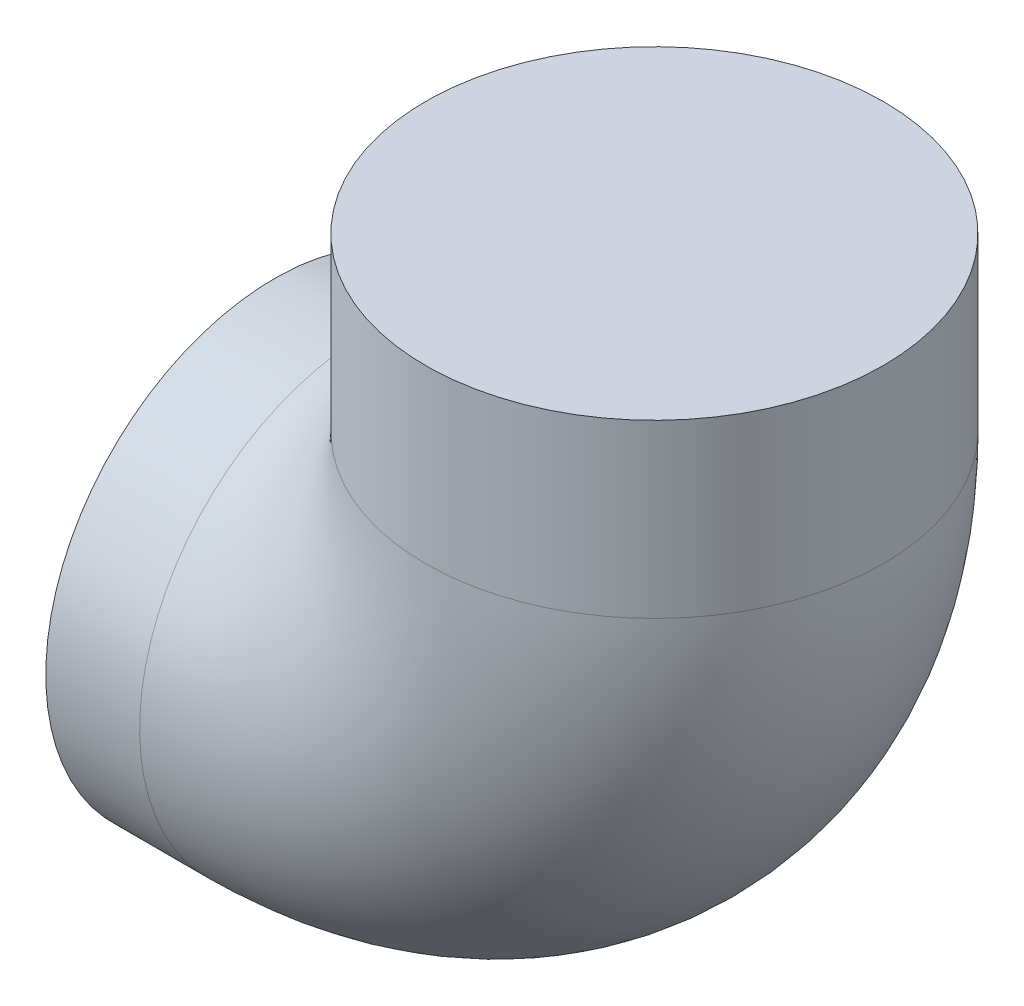
ISO-10303-21;
HEADER;
FILE_DESCRIPTION(('STEP AP214'),'2;1');
FILE_NAME('part.step','',(''),(''),'','','');
FILE_SCHEMA(('AUTOMOTIVE_DESIGN { 1 0 10303 214 1 1 1 1 }'));
ENDSEC;
DATA;
#1=APPLICATION_CONTEXT('core data for automotive mechanical design processes');
#2=APPLICATION_PROTOCOL_DEFINITION('international standard','automotive_design',2000,#1);
#3=PRODUCT_CONTEXT('',#1,'mechanical');
#4=PRODUCT('Part','Part','',(#3));
#5=PRODUCT_RELATED_PRODUCT_CATEGORY('part','',(#4));
#6=PRODUCT_DEFINITION_FORMATION('','',#4);
#7=PRODUCT_DEFINITION_CONTEXT('part definition',#1,'design');
#8=PRODUCT_DEFINITION('design','',#6,#7);
#9=PRODUCT_DEFINITION_SHAPE('','',#8);
#10=(LENGTH_UNIT() NAMED_UNIT(*) SI_UNIT(.MILLI.,.METRE.));
#11=(NAMED_UNIT(*) PLANE_ANGLE_UNIT() SI_UNIT($,.RADIAN.));
#12=(NAMED_UNIT(*) SI_UNIT($,.STERADIAN.) SOLID_ANGLE_UNIT());
#13=UNCERTAINTY_MEASURE_WITH_UNIT(LENGTH_MEASURE(1.E-05),#10,'distance_accuracy_value','');
#14=(GEOMETRIC_REPRESENTATION_CONTEXT(3) GLOBAL_UNCERTAINTY_ASSIGNED_CONTEXT((#13)) GLOBAL_UNIT_ASSIGNED_CONTEXT((#10,
#11,#12)) REPRESENTATION_CONTEXT('',''));
#15=CARTESIAN_POINT('',(0.,0.,0.));
#16=DIRECTION('',(0.,0.,1.));
#17=DIRECTION('',(1.,0.,0.));
#18=AXIS2_PLACEMENT_3D('',#15,#16,#17);
#19=CARTESIAN_POINT('',(0.,0.,0.));
#20=DIRECTION('',(1.,0.,0.));
#21=DIRECTION('',(0.,0.,-1.));
#22=AXIS2_PLACEMENT_3D('',#19,#20,#21);
#23=PLANE('',#22);
#24=CARTESIAN_POINT('',(0.,0.,0.));
#25=DIRECTION('',(1.,0.,0.));
#26=DIRECTION('',(0.,0.,-1.));
#27=AXIS2_PLACEMENT_3D('',#24,#25,#26);
#28=CIRCLE('',#27,20.);
#29=CARTESIAN_POINT('',(0.,0.,-20.));
#30=VERTEX_POINT('',#29);
#31=EDGE_CURVE('E29',#30,#30,#28,.T.);
#32=ORIENTED_EDGE('',*,*,#31,.F.);
#33=EDGE_LOOP('',(#32));
#34=FACE_BOUND('',#33,.T.);
#35=ADVANCED_FACE('F15',(#34),#23,.F.);
#36=CARTESIAN_POINT('',(33.2,40.,0.));
#37=DIRECTION('',(0.,1.,0.));
#38=DIRECTION('',(0.,0.,-1.));
#39=AXIS2_PLACEMENT_3D('',#36,#37,#38);
#40=PLANE('',#39);
#41=CARTESIAN_POINT('',(33.2,40.,0.));
#42=DIRECTION('',(0.,1.,0.));
#43=DIRECTION('',(0.,0.,-1.));
#44=AXIS2_PLACEMENT_3D('',#41,#42,#43);
#45=CIRCLE('',#44,20.);
#46=CARTESIAN_POINT('',(33.2,40.,-20.));
#47=VERTEX_POINT('',#46);
#48=EDGE_CURVE('E10',#47,#47,#45,.T.);
#49=ORIENTED_EDGE('',*,*,#48,.T.);
#50=EDGE_LOOP('',(#49));
#51=FACE_BOUND('',#50,.T.);
#52=ADVANCED_FACE('F38',(#51),#40,.T.);
#53=CARTESIAN_POINT('',(0.,0.,0.));
#54=DIRECTION('',(1.,0.,0.));
#55=DIRECTION('',(0.,0.,-1.));
#56=AXIS2_PLACEMENT_3D('',#53,#54,#55);
#57=CYLINDRICAL_SURFACE('',#56,20.);
#58=CARTESIAN_POINT('',(8.19999999999983,0.,0.));
#59=DIRECTION('',(1.,0.,0.));
#60=DIRECTION('',(0.,0.,-1.));
#61=AXIS2_PLACEMENT_3D('',#58,#59,#60);
#62=CIRCLE('',#61,20.);
#63=CARTESIAN_POINT('',(8.1999999999997,-20.,0.));
#64=VERTEX_POINT('',#63);
#65=EDGE_CURVE('E25',#64,#64,#62,.T.);
#66=ORIENTED_EDGE('',*,*,#65,.F.);
#67=EDGE_LOOP('',(#66));
#68=FACE_BOUND('',#67,.T.);
#69=ORIENTED_EDGE('',*,*,#31,.T.);
#70=EDGE_LOOP('',(#69));
#71=FACE_BOUND('',#70,.T.);
#72=ADVANCED_FACE('F35',(#68,#71),#57,.T.);
#73=CARTESIAN_POINT('',(8.2,25.,0.));
#74=DIRECTION('',(0.,0.,1.));
#75=DIRECTION('',(1.,0.,0.));
#76=AXIS2_PLACEMENT_3D('',#73,#74,#75);
#77=TOROIDAL_SURFACE('',#76,25.,20.);
#78=CARTESIAN_POINT('',(33.2,25.,0.));
#79=DIRECTION('',(0.,1.,0.));
#80=DIRECTION('',(0.,0.,-1.));
#81=AXIS2_PLACEMENT_3D('',#78,#79,#80);
#82=CIRCLE('',#81,20.);
#83=CARTESIAN_POINT('',(53.2,25.,0.));
#84=VERTEX_POINT('',#83);
#85=EDGE_CURVE('E21',#84,#84,#82,.T.);
#86=CARTESIAN_POINT('',(8.2,25.,0.));
#87=DIRECTION('',(0.,0.,1.));
#88=DIRECTION('',(1.,0.,0.));
#89=AXIS2_PLACEMENT_3D('',#86,#87,#88);
#90=CIRCLE('',#89,45.);
#91=EDGE_CURVE('',#64,#84,#90,.T.);
#92=ORIENTED_EDGE('',*,*,#65,.T.);
#93=ORIENTED_EDGE('',*,*,#85,.F.);
#94=ORIENTED_EDGE('',*,*,#91,.T.);
#95=ORIENTED_EDGE('',*,*,#91,.F.);
#96=EDGE_LOOP('',(#92,#94,#93,#95));
#97=FACE_BOUND('',#96,.T.);
#98=ADVANCED_FACE('F46',(#97),#77,.T.);
#99=CARTESIAN_POINT('',(33.2,25.,0.));
#100=DIRECTION('',(0.,1.,0.));
#101=DIRECTION('',(0.,0.,1.));
#102=AXIS2_PLACEMENT_3D('',#99,#100,#101);
#103=CYLINDRICAL_SURFACE('',#102,20.);
#104=ORIENTED_EDGE('',*,*,#48,.F.);
#105=EDGE_LOOP('',(#104));
#106=FACE_BOUND('',#105,.T.);
#107=ORIENTED_EDGE('',*,*,#85,.T.);
#108=EDGE_LOOP('',(#107));
#109=FACE_BOUND('',#108,.T.);
#110=ADVANCED_FACE('F44',(#106,#109),#103,.T.);
#111=CLOSED_SHELL('',(#35,#52,#72,#98,#110));
#112=MANIFOLD_SOLID_BREP('B1',#111);
#113=ADVANCED_BREP_SHAPE_REPRESENTATION('',(#18,#112),#14);
#114=SHAPE_DEFINITION_REPRESENTATION(#9,#113);
ENDSEC;
END-ISO-10303-21;
